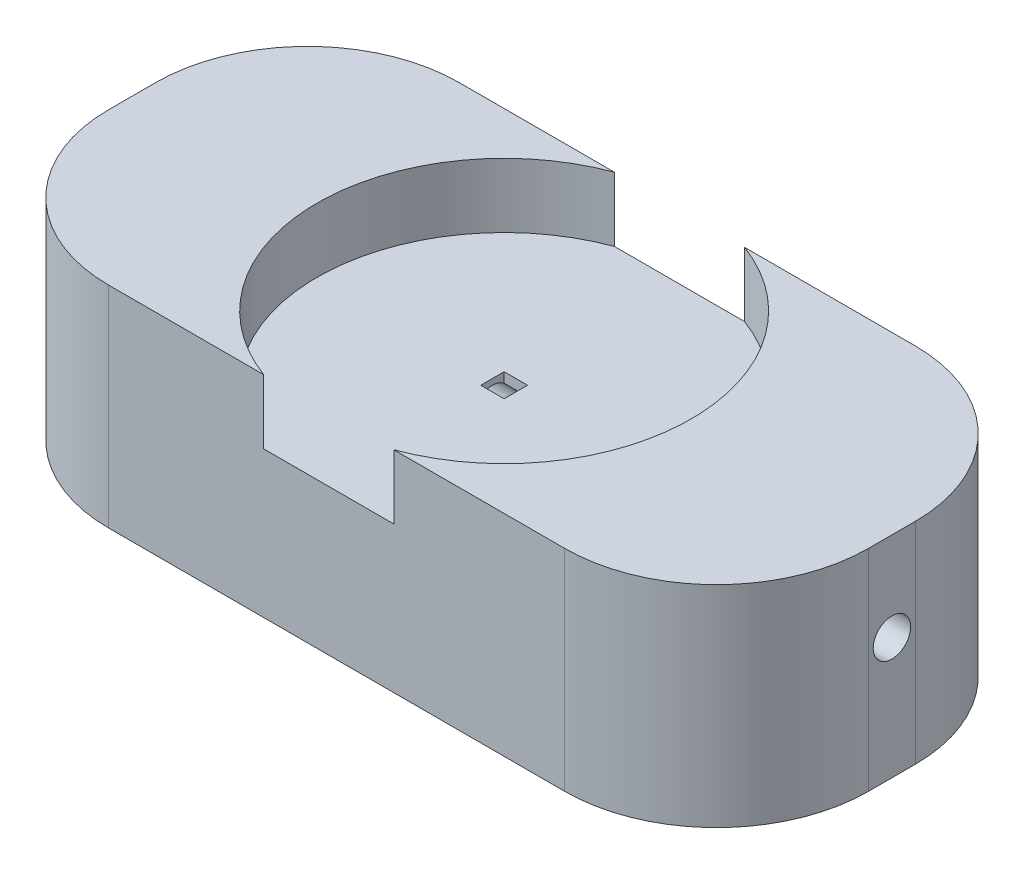
ISO-10303-21;
HEADER;
FILE_DESCRIPTION(('STEP AP214'),'2;1');
FILE_NAME('part.step','',(''),(''),'','','');
FILE_SCHEMA(('AUTOMOTIVE_DESIGN { 1 0 10303 214 1 1 1 1 }'));
ENDSEC;
DATA;
#1=APPLICATION_CONTEXT('core data for automotive mechanical design processes');
#2=APPLICATION_PROTOCOL_DEFINITION('international standard','automotive_design',2000,#1);
#3=PRODUCT_CONTEXT('',#1,'mechanical');
#4=PRODUCT('Part','Part','',(#3));
#5=PRODUCT_RELATED_PRODUCT_CATEGORY('part','',(#4));
#6=PRODUCT_DEFINITION_FORMATION('','',#4);
#7=PRODUCT_DEFINITION_CONTEXT('part definition',#1,'design');
#8=PRODUCT_DEFINITION('design','',#6,#7);
#9=PRODUCT_DEFINITION_SHAPE('','',#8);
#10=(LENGTH_UNIT() NAMED_UNIT(*) SI_UNIT(.MILLI.,.METRE.));
#11=(NAMED_UNIT(*) PLANE_ANGLE_UNIT() SI_UNIT($,.RADIAN.));
#12=(NAMED_UNIT(*) SI_UNIT($,.STERADIAN.) SOLID_ANGLE_UNIT());
#13=UNCERTAINTY_MEASURE_WITH_UNIT(LENGTH_MEASURE(1.E-05),#10,'distance_accuracy_value','');
#14=(GEOMETRIC_REPRESENTATION_CONTEXT(3) GLOBAL_UNCERTAINTY_ASSIGNED_CONTEXT((#13)) GLOBAL_UNIT_ASSIGNED_CONTEXT((#10,
#11,#12)) REPRESENTATION_CONTEXT('',''));
#15=CARTESIAN_POINT('',(0.,0.,0.));
#16=DIRECTION('',(0.,0.,1.));
#17=DIRECTION('',(1.,0.,0.));
#18=AXIS2_PLACEMENT_3D('',#15,#16,#17);
#19=CARTESIAN_POINT('',(0.,58.,0.));
#20=DIRECTION('',(0.,-1.,0.));
#21=DIRECTION('',(0.,0.,-1.));
#22=AXIS2_PLACEMENT_3D('',#19,#20,#21);
#23=PLANE('',#22);
#24=DIRECTION('',(-1.,0.,0.));
#25=VECTOR('',#24,1.);
#26=CARTESIAN_POINT('',(-25.,58.,-15.));
#27=LINE('',#26,#25);
#28=CARTESIAN_POINT('',(27.,58.,-15.));
#29=VERTEX_POINT('',#28);
#30=CARTESIAN_POINT('',(12.3962726493241,58.,-15.));
#31=VERTEX_POINT('',#30);
#32=EDGE_CURVE('E307',#29,#31,#27,.T.);
#33=ORIENTED_EDGE('',*,*,#32,.T.);
#34=CARTESIAN_POINT('',(6.82850828649366,58.,-1.6826817716975E-13));
#35=DIRECTION('',(0.,1.,0.));
#36=DIRECTION('',(0.,0.,1.));
#37=AXIS2_PLACEMENT_3D('',#34,#35,#36);
#38=CIRCLE('',#37,16.);
#39=CARTESIAN_POINT('',(12.3962726493232,58.,15.));
#40=VERTEX_POINT('',#39);
#41=EDGE_CURVE('E248',#40,#31,#38,.T.);
#42=ORIENTED_EDGE('',*,*,#41,.F.);
#43=DIRECTION('',(1.,0.,0.));
#44=VECTOR('',#43,1.);
#45=CARTESIAN_POINT('',(-25.,58.,15.));
#46=LINE('',#45,#44);
#47=CARTESIAN_POINT('',(27.,58.,15.));
#48=VERTEX_POINT('',#47);
#49=EDGE_CURVE('E315',#40,#48,#46,.T.);
#50=ORIENTED_EDGE('',*,*,#49,.T.);
#51=CARTESIAN_POINT('',(27.,58.,2.00000000000001));
#52=DIRECTION('',(0.,-1.,0.));
#53=DIRECTION('',(0.,0.,-1.));
#54=AXIS2_PLACEMENT_3D('',#51,#52,#53);
#55=CIRCLE('',#54,13.);
#56=CARTESIAN_POINT('',(40.,58.,2.00000000000001));
#57=VERTEX_POINT('',#56);
#58=EDGE_CURVE('E338',#48,#57,#55,.F.);
#59=ORIENTED_EDGE('',*,*,#58,.T.);
#60=DIRECTION('',(0.,0.,-1.));
#61=VECTOR('',#60,1.);
#62=CARTESIAN_POINT('',(40.,58.,15.));
#63=LINE('',#62,#61);
#64=CARTESIAN_POINT('',(40.,58.,-2.));
#65=VERTEX_POINT('',#64);
#66=EDGE_CURVE('E302',#57,#65,#63,.T.);
#67=ORIENTED_EDGE('',*,*,#66,.T.);
#68=CARTESIAN_POINT('',(27.,58.,-2.));
#69=DIRECTION('',(0.,-1.,0.));
#70=DIRECTION('',(0.,0.,-1.));
#71=AXIS2_PLACEMENT_3D('',#68,#69,#70);
#72=CIRCLE('',#71,13.);
#73=EDGE_CURVE('E344',#65,#29,#72,.F.);
#74=ORIENTED_EDGE('',*,*,#73,.T.);
#75=EDGE_LOOP('',(#33,#42,#50,#59,#67,#74));
#76=FACE_BOUND('',#75,.T.);
#77=ADVANCED_FACE('F47',(#76),#23,.F.);
#78=CARTESIAN_POINT('',(40.,58.,15.));
#79=DIRECTION('',(-1.,0.,0.));
#80=DIRECTION('',(0.,0.,1.));
#81=AXIS2_PLACEMENT_3D('',#78,#79,#80);
#82=PLANE('',#81);
#83=CARTESIAN_POINT('',(40.,50.4,0.));
#84=DIRECTION('',(-1.,0.,0.));
#85=DIRECTION('',(0.,0.,1.));
#86=AXIS2_PLACEMENT_3D('',#83,#84,#85);
#87=CIRCLE('',#86,1.6);
#88=CARTESIAN_POINT('',(40.,50.4,1.6));
#89=VERTEX_POINT('',#88);
#90=EDGE_CURVE('E244',#89,#89,#87,.T.);
#91=ORIENTED_EDGE('',*,*,#90,.T.);
#92=EDGE_LOOP('',(#91));
#93=FACE_BOUND('',#92,.T.);
#94=DIRECTION('',(0.,0.,1.));
#95=VECTOR('',#94,1.);
#96=CARTESIAN_POINT('',(40.,40.,15.));
#97=LINE('',#96,#95);
#98=CARTESIAN_POINT('',(40.,40.,-2.));
#99=VERTEX_POINT('',#98);
#100=CARTESIAN_POINT('',(40.,40.,2.00000000000001));
#101=VERTEX_POINT('',#100);
#102=EDGE_CURVE('E295',#99,#101,#97,.T.);
#103=ORIENTED_EDGE('',*,*,#102,.F.);
#104=DIRECTION('',(0.,-1.,0.));
#105=VECTOR('',#104,1.);
#106=CARTESIAN_POINT('',(40.,58.,-2.));
#107=LINE('',#106,#105);
#108=EDGE_CURVE('E332',#99,#65,#107,.F.);
#109=ORIENTED_EDGE('',*,*,#108,.T.);
#110=ORIENTED_EDGE('',*,*,#66,.F.);
#111=DIRECTION('',(0.,-1.,0.));
#112=VECTOR('',#111,1.);
#113=CARTESIAN_POINT('',(40.,58.,2.00000000000001));
#114=LINE('',#113,#112);
#115=EDGE_CURVE('E328',#57,#101,#114,.T.);
#116=ORIENTED_EDGE('',*,*,#115,.T.);
#117=EDGE_LOOP('',(#103,#109,#110,#116));
#118=FACE_BOUND('',#117,.T.);
#119=ADVANCED_FACE('F414',(#93,#118),#82,.F.);
#120=CARTESIAN_POINT('',(-25.,58.,-15.));
#121=DIRECTION('',(0.,0.,1.));
#122=DIRECTION('',(1.,0.,0.));
#123=AXIS2_PLACEMENT_3D('',#120,#121,#122);
#124=PLANE('',#123);
#125=DIRECTION('',(-1.,0.,0.));
#126=VECTOR('',#125,1.);
#127=CARTESIAN_POINT('',(-25.,52.5,-15.));
#128=LINE('',#127,#126);
#129=CARTESIAN_POINT('',(12.3962726493241,52.5,-15.));
#130=VERTEX_POINT('',#129);
#131=CARTESIAN_POINT('',(1.26074392366317,52.5,-15.));
#132=VERTEX_POINT('',#131);
#133=EDGE_CURVE('E275',#130,#132,#128,.T.);
#134=ORIENTED_EDGE('',*,*,#133,.F.);
#135=DIRECTION('',(0.,1.,0.));
#136=VECTOR('',#135,1.);
#137=CARTESIAN_POINT('',(12.3962726493241,52.5,-15.));
#138=LINE('',#137,#136);
#139=EDGE_CURVE('E271',#130,#31,#138,.T.);
#140=ORIENTED_EDGE('',*,*,#139,.T.);
#141=ORIENTED_EDGE('',*,*,#32,.F.);
#142=DIRECTION('',(0.,-1.,0.));
#143=VECTOR('',#142,1.);
#144=CARTESIAN_POINT('',(27.,58.,-15.));
#145=LINE('',#144,#143);
#146=CARTESIAN_POINT('',(27.,40.,-15.));
#147=VERTEX_POINT('',#146);
#148=EDGE_CURVE('E324',#29,#147,#145,.T.);
#149=ORIENTED_EDGE('',*,*,#148,.T.);
#150=DIRECTION('',(1.,0.,0.));
#151=VECTOR('',#150,1.);
#152=CARTESIAN_POINT('',(-25.,40.,-15.));
#153=LINE('',#152,#151);
#154=CARTESIAN_POINT('',(-12.,40.,-15.));
#155=VERTEX_POINT('',#154);
#156=EDGE_CURVE('E292',#155,#147,#153,.T.);
#157=ORIENTED_EDGE('',*,*,#156,.F.);
#158=DIRECTION('',(0.,-1.,0.));
#159=VECTOR('',#158,1.);
#160=CARTESIAN_POINT('',(-12.,58.,-15.));
#161=LINE('',#160,#159);
#162=CARTESIAN_POINT('',(-12.,58.,-15.));
#163=VERTEX_POINT('',#162);
#164=EDGE_CURVE('E320',#155,#163,#161,.F.);
#165=ORIENTED_EDGE('',*,*,#164,.T.);
#166=CARTESIAN_POINT('',(1.26074392366317,58.,-15.));
#167=VERTEX_POINT('',#166);
#168=EDGE_CURVE('E306',#167,#163,#27,.T.);
#169=ORIENTED_EDGE('',*,*,#168,.F.);
#170=DIRECTION('',(0.,1.,0.));
#171=VECTOR('',#170,1.);
#172=CARTESIAN_POINT('',(1.26074392366316,52.5,-15.));
#173=LINE('',#172,#171);
#174=EDGE_CURVE('E267',#167,#132,#173,.F.);
#175=ORIENTED_EDGE('',*,*,#174,.T.);
#176=EDGE_LOOP('',(#134,#140,#141,#149,#157,#165,#169,#175));
#177=FACE_BOUND('',#176,.T.);
#178=ADVANCED_FACE('F423',(#177),#124,.F.);
#179=CARTESIAN_POINT('',(-25.,58.,15.));
#180=DIRECTION('',(1.,0.,0.));
#181=DIRECTION('',(0.,0.,-1.));
#182=AXIS2_PLACEMENT_3D('',#179,#180,#181);
#183=PLANE('',#182);
#184=CARTESIAN_POINT('',(-25.,50.4,0.));
#185=DIRECTION('',(-1.,0.,0.));
#186=DIRECTION('',(0.,0.,1.));
#187=AXIS2_PLACEMENT_3D('',#184,#185,#186);
#188=CIRCLE('',#187,1.6);
#189=CARTESIAN_POINT('',(-25.,50.4,1.6));
#190=VERTEX_POINT('',#189);
#191=EDGE_CURVE('E235',#190,#190,#188,.T.);
#192=ORIENTED_EDGE('',*,*,#191,.F.);
#193=EDGE_LOOP('',(#192));
#194=FACE_BOUND('',#193,.T.);
#195=DIRECTION('',(0.,0.,-1.));
#196=VECTOR('',#195,1.);
#197=CARTESIAN_POINT('',(-25.,40.,15.));
#198=LINE('',#197,#196);
#199=CARTESIAN_POINT('',(-25.,40.,2.00000000000001));
#200=VERTEX_POINT('',#199);
#201=CARTESIAN_POINT('',(-25.,40.,-1.99999999999999));
#202=VERTEX_POINT('',#201);
#203=EDGE_CURVE('E281',#200,#202,#198,.T.);
#204=ORIENTED_EDGE('',*,*,#203,.F.);
#205=DIRECTION('',(0.,-1.,0.));
#206=VECTOR('',#205,1.);
#207=CARTESIAN_POINT('',(-25.,58.,2.00000000000001));
#208=LINE('',#207,#206);
#209=CARTESIAN_POINT('',(-25.,58.,2.00000000000001));
#210=VERTEX_POINT('',#209);
#211=EDGE_CURVE('E347',#200,#210,#208,.F.);
#212=ORIENTED_EDGE('',*,*,#211,.T.);
#213=DIRECTION('',(0.,0.,1.));
#214=VECTOR('',#213,1.);
#215=CARTESIAN_POINT('',(-25.,58.,15.));
#216=LINE('',#215,#214);
#217=CARTESIAN_POINT('',(-25.,58.,-1.99999999999999));
#218=VERTEX_POINT('',#217);
#219=EDGE_CURVE('E311',#218,#210,#216,.T.);
#220=ORIENTED_EDGE('',*,*,#219,.F.);
#221=DIRECTION('',(0.,-1.,0.));
#222=VECTOR('',#221,1.);
#223=CARTESIAN_POINT('',(-25.,58.,-1.99999999999999));
#224=LINE('',#223,#222);
#225=EDGE_CURVE('E350',#218,#202,#224,.T.);
#226=ORIENTED_EDGE('',*,*,#225,.T.);
#227=EDGE_LOOP('',(#204,#212,#220,#226));
#228=FACE_BOUND('',#227,.T.);
#229=ADVANCED_FACE('F451',(#194,#228),#183,.F.);
#230=CARTESIAN_POINT('',(-25.,58.,15.));
#231=DIRECTION('',(0.,0.,-1.));
#232=DIRECTION('',(-1.,0.,0.));
#233=AXIS2_PLACEMENT_3D('',#230,#231,#232);
#234=PLANE('',#233);
#235=DIRECTION('',(1.,0.,0.));
#236=VECTOR('',#235,1.);
#237=CARTESIAN_POINT('',(-25.,52.5,15.));
#238=LINE('',#237,#236);
#239=CARTESIAN_POINT('',(1.2607439236641,52.5,15.));
#240=VERTEX_POINT('',#239);
#241=CARTESIAN_POINT('',(12.3962726493232,52.5,15.));
#242=VERTEX_POINT('',#241);
#243=EDGE_CURVE('E370',#240,#242,#238,.T.);
#244=ORIENTED_EDGE('',*,*,#243,.F.);
#245=DIRECTION('',(0.,1.,0.));
#246=VECTOR('',#245,1.);
#247=CARTESIAN_POINT('',(1.26074392366409,52.5,15.));
#248=LINE('',#247,#246);
#249=CARTESIAN_POINT('',(1.2607439236641,58.,15.));
#250=VERTEX_POINT('',#249);
#251=EDGE_CURVE('E263',#240,#250,#248,.T.);
#252=ORIENTED_EDGE('',*,*,#251,.T.);
#253=CARTESIAN_POINT('',(-12.,58.,15.));
#254=VERTEX_POINT('',#253);
#255=EDGE_CURVE('E316',#254,#250,#46,.T.);
#256=ORIENTED_EDGE('',*,*,#255,.F.);
#257=DIRECTION('',(0.,-1.,0.));
#258=VECTOR('',#257,1.);
#259=CARTESIAN_POINT('',(-12.,58.,15.));
#260=LINE('',#259,#258);
#261=CARTESIAN_POINT('',(-12.,40.,15.));
#262=VERTEX_POINT('',#261);
#263=EDGE_CURVE('E354',#254,#262,#260,.T.);
#264=ORIENTED_EDGE('',*,*,#263,.T.);
#265=DIRECTION('',(-1.,0.,0.));
#266=VECTOR('',#265,1.);
#267=CARTESIAN_POINT('',(-25.,40.,15.));
#268=LINE('',#267,#266);
#269=CARTESIAN_POINT('',(27.,40.,15.));
#270=VERTEX_POINT('',#269);
#271=EDGE_CURVE('E278',#270,#262,#268,.T.);
#272=ORIENTED_EDGE('',*,*,#271,.F.);
#273=DIRECTION('',(0.,-1.,0.));
#274=VECTOR('',#273,1.);
#275=CARTESIAN_POINT('',(27.,58.,15.));
#276=LINE('',#275,#274);
#277=EDGE_CURVE('E358',#270,#48,#276,.F.);
#278=ORIENTED_EDGE('',*,*,#277,.T.);
#279=ORIENTED_EDGE('',*,*,#49,.F.);
#280=DIRECTION('',(0.,1.,0.));
#281=VECTOR('',#280,1.);
#282=CARTESIAN_POINT('',(12.3962726493232,52.5,15.));
#283=LINE('',#282,#281);
#284=EDGE_CURVE('E256',#40,#242,#283,.F.);
#285=ORIENTED_EDGE('',*,*,#284,.T.);
#286=EDGE_LOOP('',(#244,#252,#256,#264,#272,#278,#279,#285));
#287=FACE_BOUND('',#286,.T.);
#288=ADVANCED_FACE('F446',(#287),#234,.F.);
#289=CARTESIAN_POINT('',(27.,58.,-2.));
#290=DIRECTION('',(0.,-1.,0.));
#291=DIRECTION('',(0.,0.,-1.));
#292=AXIS2_PLACEMENT_3D('',#289,#290,#291);
#293=CYLINDRICAL_SURFACE('',#292,13.);
#294=ORIENTED_EDGE('',*,*,#108,.F.);
#295=CARTESIAN_POINT('',(27.,40.,-2.));
#296=DIRECTION('',(0.,-1.,0.));
#297=DIRECTION('',(0.,0.,-1.));
#298=AXIS2_PLACEMENT_3D('',#295,#296,#297);
#299=CIRCLE('',#298,13.);
#300=EDGE_CURVE('E298',#99,#147,#299,.F.);
#301=ORIENTED_EDGE('',*,*,#300,.T.);
#302=ORIENTED_EDGE('',*,*,#148,.F.);
#303=ORIENTED_EDGE('',*,*,#73,.F.);
#304=EDGE_LOOP('',(#294,#301,#302,#303));
#305=FACE_BOUND('',#304,.T.);
#306=ADVANCED_FACE('F466',(#305),#293,.T.);
#307=CARTESIAN_POINT('',(-12.,58.,-1.99999999999999));
#308=DIRECTION('',(0.,-1.,0.));
#309=DIRECTION('',(0.,0.,-1.));
#310=AXIS2_PLACEMENT_3D('',#307,#308,#309);
#311=CYLINDRICAL_SURFACE('',#310,13.);
#312=ORIENTED_EDGE('',*,*,#164,.F.);
#313=CARTESIAN_POINT('',(-12.,40.,-1.99999999999999));
#314=DIRECTION('',(0.,-1.,0.));
#315=DIRECTION('',(0.,0.,-1.));
#316=AXIS2_PLACEMENT_3D('',#313,#314,#315);
#317=CIRCLE('',#316,13.);
#318=EDGE_CURVE('E288',#155,#202,#317,.F.);
#319=ORIENTED_EDGE('',*,*,#318,.T.);
#320=ORIENTED_EDGE('',*,*,#225,.F.);
#321=CARTESIAN_POINT('',(-12.,58.,-1.99999999999999));
#322=DIRECTION('',(0.,-1.,0.));
#323=DIRECTION('',(0.,0.,-1.));
#324=AXIS2_PLACEMENT_3D('',#321,#322,#323);
#325=CIRCLE('',#324,13.);
#326=EDGE_CURVE('E341',#163,#218,#325,.F.);
#327=ORIENTED_EDGE('',*,*,#326,.F.);
#328=EDGE_LOOP('',(#312,#319,#320,#327));
#329=FACE_BOUND('',#328,.T.);
#330=ADVANCED_FACE('F457',(#329),#311,.T.);
#331=CARTESIAN_POINT('',(27.,58.,2.00000000000001));
#332=DIRECTION('',(0.,-1.,0.));
#333=DIRECTION('',(0.,0.,-1.));
#334=AXIS2_PLACEMENT_3D('',#331,#332,#333);
#335=CYLINDRICAL_SURFACE('',#334,13.);
#336=ORIENTED_EDGE('',*,*,#277,.F.);
#337=CARTESIAN_POINT('',(27.,40.,2.00000000000001));
#338=DIRECTION('',(0.,-1.,0.));
#339=DIRECTION('',(0.,0.,-1.));
#340=AXIS2_PLACEMENT_3D('',#337,#338,#339);
#341=CIRCLE('',#340,13.);
#342=EDGE_CURVE('E284',#270,#101,#341,.F.);
#343=ORIENTED_EDGE('',*,*,#342,.T.);
#344=ORIENTED_EDGE('',*,*,#115,.F.);
#345=ORIENTED_EDGE('',*,*,#58,.F.);
#346=EDGE_LOOP('',(#336,#343,#344,#345));
#347=FACE_BOUND('',#346,.T.);
#348=ADVANCED_FACE('F438',(#347),#335,.T.);
#349=CARTESIAN_POINT('',(-12.,58.,2.00000000000001));
#350=DIRECTION('',(0.,-1.,0.));
#351=DIRECTION('',(0.,0.,-1.));
#352=AXIS2_PLACEMENT_3D('',#349,#350,#351);
#353=CYLINDRICAL_SURFACE('',#352,13.);
#354=ORIENTED_EDGE('',*,*,#211,.F.);
#355=CARTESIAN_POINT('',(-12.,40.,2.00000000000001));
#356=DIRECTION('',(0.,-1.,0.));
#357=DIRECTION('',(0.,0.,-1.));
#358=AXIS2_PLACEMENT_3D('',#355,#356,#357);
#359=CIRCLE('',#358,13.);
#360=EDGE_CURVE('E362',#200,#262,#359,.F.);
#361=ORIENTED_EDGE('',*,*,#360,.T.);
#362=ORIENTED_EDGE('',*,*,#263,.F.);
#363=CARTESIAN_POINT('',(-12.,58.,2.00000000000001));
#364=DIRECTION('',(0.,-1.,0.));
#365=DIRECTION('',(0.,0.,-1.));
#366=AXIS2_PLACEMENT_3D('',#363,#364,#365);
#367=CIRCLE('',#366,13.);
#368=EDGE_CURVE('E335',#210,#254,#367,.F.);
#369=ORIENTED_EDGE('',*,*,#368,.F.);
#370=EDGE_LOOP('',(#354,#361,#362,#369));
#371=FACE_BOUND('',#370,.T.);
#372=ADVANCED_FACE('F49',(#371),#353,.T.);
#373=ORIENTED_EDGE('',*,*,#255,.T.);
#374=CARTESIAN_POINT('',(6.82850828649366,58.,-1.6826817716975E-13));
#375=DIRECTION('',(0.,-1.,0.));
#376=DIRECTION('',(0.,0.,-1.));
#377=AXIS2_PLACEMENT_3D('',#374,#375,#376);
#378=CIRCLE('',#377,16.);
#379=EDGE_CURVE('E366',#250,#167,#378,.T.);
#380=ORIENTED_EDGE('',*,*,#379,.T.);
#381=ORIENTED_EDGE('',*,*,#168,.T.);
#382=ORIENTED_EDGE('',*,*,#326,.T.);
#383=ORIENTED_EDGE('',*,*,#219,.T.);
#384=ORIENTED_EDGE('',*,*,#368,.T.);
#385=EDGE_LOOP('',(#373,#380,#381,#382,#383,#384));
#386=FACE_BOUND('',#385,.T.);
#387=ADVANCED_FACE('F417',(#386),#23,.F.);
#388=CARTESIAN_POINT('',(0.,40.,0.));
#389=DIRECTION('',(0.,-1.,0.));
#390=DIRECTION('',(0.,0.,-1.));
#391=AXIS2_PLACEMENT_3D('',#388,#389,#390);
#392=PLANE('',#391);
#393=ORIENTED_EDGE('',*,*,#102,.T.);
#394=ORIENTED_EDGE('',*,*,#342,.F.);
#395=ORIENTED_EDGE('',*,*,#271,.T.);
#396=ORIENTED_EDGE('',*,*,#360,.F.);
#397=ORIENTED_EDGE('',*,*,#203,.T.);
#398=ORIENTED_EDGE('',*,*,#318,.F.);
#399=ORIENTED_EDGE('',*,*,#156,.T.);
#400=ORIENTED_EDGE('',*,*,#300,.F.);
#401=EDGE_LOOP('',(#393,#394,#395,#396,#397,#398,#399,#400));
#402=FACE_BOUND('',#401,.T.);
#403=ADVANCED_FACE('F429',(#402),#392,.T.);
#404=CARTESIAN_POINT('',(6.82850828649366,52.5,-1.6826817716975E-13));
#405=DIRECTION('',(0.,1.,0.));
#406=DIRECTION('',(0.,0.,1.));
#407=AXIS2_PLACEMENT_3D('',#404,#405,#406);
#408=PLANE('',#407);
#409=DIRECTION('',(0.,0.,-1.));
#410=VECTOR('',#409,1.);
#411=CARTESIAN_POINT('',(7.82850828649366,52.5,0.999999999999832));
#412=LINE('',#411,#410);
#413=CARTESIAN_POINT('',(7.82850828649366,52.5,0.999999999999832));
#414=VERTEX_POINT('',#413);
#415=CARTESIAN_POINT('',(7.82850828649366,52.5,-1.00000000000017));
#416=VERTEX_POINT('',#415);
#417=EDGE_CURVE('E65',#414,#416,#412,.T.);
#418=ORIENTED_EDGE('',*,*,#417,.F.);
#419=DIRECTION('',(1.,0.,0.));
#420=VECTOR('',#419,1.);
#421=CARTESIAN_POINT('',(5.82850828649366,52.5,0.999999999999832));
#422=LINE('',#421,#420);
#423=CARTESIAN_POINT('',(5.82850828649366,52.5,0.999999999999832));
#424=VERTEX_POINT('',#423);
#425=EDGE_CURVE('E212',#424,#414,#422,.T.);
#426=ORIENTED_EDGE('',*,*,#425,.F.);
#427=DIRECTION('',(0.,0.,1.));
#428=VECTOR('',#427,1.);
#429=CARTESIAN_POINT('',(5.82850828649366,52.5,0.999999999999832));
#430=LINE('',#429,#428);
#431=CARTESIAN_POINT('',(5.82850828649366,52.5,-1.00000000000017));
#432=VERTEX_POINT('',#431);
#433=EDGE_CURVE('E216',#432,#424,#430,.T.);
#434=ORIENTED_EDGE('',*,*,#433,.F.);
#435=DIRECTION('',(-1.,0.,0.));
#436=VECTOR('',#435,1.);
#437=CARTESIAN_POINT('',(5.82850828649366,52.5,-1.00000000000017));
#438=LINE('',#437,#436);
#439=EDGE_CURVE('E225',#416,#432,#438,.T.);
#440=ORIENTED_EDGE('',*,*,#439,.F.);
#441=EDGE_LOOP('',(#418,#426,#434,#440));
#442=FACE_BOUND('',#441,.T.);
#443=ORIENTED_EDGE('',*,*,#133,.T.);
#444=CARTESIAN_POINT('',(6.82850828649366,52.5,-1.6826817716975E-13));
#445=DIRECTION('',(0.,1.,0.));
#446=DIRECTION('',(0.,0.,1.));
#447=AXIS2_PLACEMENT_3D('',#444,#445,#446);
#448=CIRCLE('',#447,16.);
#449=EDGE_CURVE('E257',#132,#240,#448,.T.);
#450=ORIENTED_EDGE('',*,*,#449,.T.);
#451=ORIENTED_EDGE('',*,*,#243,.T.);
#452=EDGE_CURVE('E252',#242,#130,#448,.T.);
#453=ORIENTED_EDGE('',*,*,#452,.T.);
#454=EDGE_LOOP('',(#443,#450,#451,#453));
#455=FACE_BOUND('',#454,.T.);
#456=ADVANCED_FACE('F435',(#442,#455),#408,.T.);
#457=CARTESIAN_POINT('',(6.82850828649366,52.5,-1.6826817716975E-13));
#458=DIRECTION('',(0.,1.,0.));
#459=DIRECTION('',(0.,0.,1.));
#460=AXIS2_PLACEMENT_3D('',#457,#458,#459);
#461=CYLINDRICAL_SURFACE('',#460,16.);
#462=ORIENTED_EDGE('',*,*,#452,.F.);
#463=ORIENTED_EDGE('',*,*,#284,.F.);
#464=ORIENTED_EDGE('',*,*,#41,.T.);
#465=ORIENTED_EDGE('',*,*,#139,.F.);
#466=EDGE_LOOP('',(#462,#463,#464,#465));
#467=FACE_BOUND('',#466,.T.);
#468=ADVANCED_FACE('F570',(#467),#461,.F.);
#469=ORIENTED_EDGE('',*,*,#379,.F.);
#470=ORIENTED_EDGE('',*,*,#251,.F.);
#471=ORIENTED_EDGE('',*,*,#449,.F.);
#472=ORIENTED_EDGE('',*,*,#174,.F.);
#473=EDGE_LOOP('',(#469,#470,#471,#472));
#474=FACE_BOUND('',#473,.T.);
#475=ADVANCED_FACE('F560',(#474),#461,.F.);
#476=CARTESIAN_POINT('',(40.,50.4,0.));
#477=DIRECTION('',(-1.,0.,0.));
#478=DIRECTION('',(0.,0.,1.));
#479=AXIS2_PLACEMENT_3D('',#476,#477,#478);
#480=CYLINDRICAL_SURFACE('',#479,1.6);
#481=DIRECTION('',(-1.,0.,0.));
#482=VECTOR('',#481,1.);
#483=CARTESIAN_POINT('',(40.,49.1510004003205,-1.00000000000017));
#484=LINE('',#483,#482);
#485=CARTESIAN_POINT('',(5.82850828649366,49.1510004003205,-1.00000000000017));
#486=VERTEX_POINT('',#485);
#487=CARTESIAN_POINT('',(7.82850828649365,49.1510004003205,-1.00000000000017));
#488=VERTEX_POINT('',#487);
#489=EDGE_CURVE('E387',#486,#488,#484,.F.);
#490=ORIENTED_EDGE('',*,*,#489,.T.);
#491=CARTESIAN_POINT('',(7.82850828649365,50.4,0.));
#492=DIRECTION('',(1.,0.,0.));
#493=DIRECTION('',(0.,0.,-1.));
#494=AXIS2_PLACEMENT_3D('',#491,#492,#493);
#495=CIRCLE('',#494,1.6);
#496=CARTESIAN_POINT('',(7.82850828649366,49.1510004003202,0.999999999999832));
#497=VERTEX_POINT('',#496);
#498=EDGE_CURVE('E11',#488,#497,#495,.F.);
#499=ORIENTED_EDGE('',*,*,#498,.T.);
#500=DIRECTION('',(-1.,0.,0.));
#501=VECTOR('',#500,1.);
#502=CARTESIAN_POINT('',(40.,49.1510004003202,0.999999999999832));
#503=LINE('',#502,#501);
#504=CARTESIAN_POINT('',(5.82850828649366,49.1510004003202,0.999999999999832));
#505=VERTEX_POINT('',#504);
#506=EDGE_CURVE('E51',#497,#505,#503,.T.);
#507=ORIENTED_EDGE('',*,*,#506,.T.);
#508=CARTESIAN_POINT('',(5.82850828649366,50.4,0.));
#509=DIRECTION('',(-1.,0.,0.));
#510=DIRECTION('',(0.,0.,1.));
#511=AXIS2_PLACEMENT_3D('',#508,#509,#510);
#512=CIRCLE('',#511,1.6);
#513=EDGE_CURVE('E382',#505,#486,#512,.F.);
#514=ORIENTED_EDGE('',*,*,#513,.T.);
#515=EDGE_LOOP('',(#490,#499,#507,#514));
#516=FACE_BOUND('',#515,.T.);
#517=DIRECTION('',(-1.,0.,0.));
#518=VECTOR('',#517,1.);
#519=CARTESIAN_POINT('',(40.,51.6489995996798,0.999999999999832));
#520=LINE('',#519,#518);
#521=CARTESIAN_POINT('',(5.82850828649366,51.6489995996798,0.999999999999832));
#522=VERTEX_POINT('',#521);
#523=CARTESIAN_POINT('',(7.82850828649366,51.6489995996798,0.999999999999832));
#524=VERTEX_POINT('',#523);
#525=EDGE_CURVE('E381',#522,#524,#520,.F.);
#526=ORIENTED_EDGE('',*,*,#525,.T.);
#527=CARTESIAN_POINT('',(7.82850828649366,51.6489995996795,-1.00000000000017));
#528=VERTEX_POINT('',#527);
#529=EDGE_CURVE('E58',#524,#528,#495,.F.);
#530=ORIENTED_EDGE('',*,*,#529,.T.);
#531=DIRECTION('',(-1.,0.,0.));
#532=VECTOR('',#531,1.);
#533=CARTESIAN_POINT('',(40.,51.6489995996795,-1.00000000000017));
#534=LINE('',#533,#532);
#535=CARTESIAN_POINT('',(5.82850828649366,51.6489995996795,-1.00000000000017));
#536=VERTEX_POINT('',#535);
#537=EDGE_CURVE('E373',#528,#536,#534,.T.);
#538=ORIENTED_EDGE('',*,*,#537,.T.);
#539=EDGE_CURVE('E377',#536,#522,#512,.F.);
#540=ORIENTED_EDGE('',*,*,#539,.T.);
#541=EDGE_LOOP('',(#526,#530,#538,#540));
#542=FACE_BOUND('',#541,.T.);
#543=ORIENTED_EDGE('',*,*,#90,.F.);
#544=EDGE_LOOP('',(#543));
#545=FACE_BOUND('',#544,.T.);
#546=ORIENTED_EDGE('',*,*,#191,.T.);
#547=EDGE_LOOP('',(#546));
#548=FACE_BOUND('',#547,.T.);
#549=ADVANCED_FACE('F394',(#516,#542,#545,#548),#480,.F.);
#550=CARTESIAN_POINT('',(5.82850828649366,44.5,-1.00000000000017));
#551=DIRECTION('',(0.,0.,-1.));
#552=DIRECTION('',(-1.,0.,0.));
#553=AXIS2_PLACEMENT_3D('',#550,#551,#552);
#554=PLANE('',#553);
#555=DIRECTION('',(0.,1.,0.));
#556=VECTOR('',#555,1.);
#557=CARTESIAN_POINT('',(7.82850828649366,44.5,-1.00000000000017));
#558=LINE('',#557,#556);
#559=EDGE_CURVE('E195',#528,#416,#558,.T.);
#560=ORIENTED_EDGE('',*,*,#559,.T.);
#561=ORIENTED_EDGE('',*,*,#439,.T.);
#562=DIRECTION('',(0.,1.,0.));
#563=VECTOR('',#562,1.);
#564=CARTESIAN_POINT('',(5.82850828649366,44.5,-1.00000000000017));
#565=LINE('',#564,#563);
#566=EDGE_CURVE('E194',#536,#432,#565,.T.);
#567=ORIENTED_EDGE('',*,*,#566,.F.);
#568=ORIENTED_EDGE('',*,*,#537,.F.);
#569=EDGE_LOOP('',(#560,#561,#567,#568));
#570=FACE_BOUND('',#569,.T.);
#571=ADVANCED_FACE('F408',(#570),#554,.F.);
#572=CARTESIAN_POINT('',(5.82850828649366,44.5,0.999999999999832));
#573=DIRECTION('',(-1.,0.,0.));
#574=DIRECTION('',(0.,0.,1.));
#575=AXIS2_PLACEMENT_3D('',#572,#573,#574);
#576=PLANE('',#575);
#577=ORIENTED_EDGE('',*,*,#566,.T.);
#578=ORIENTED_EDGE('',*,*,#433,.T.);
#579=DIRECTION('',(0.,1.,0.));
#580=VECTOR('',#579,1.);
#581=CARTESIAN_POINT('',(5.82850828649366,44.5,0.999999999999832));
#582=LINE('',#581,#580);
#583=EDGE_CURVE('E241',#522,#424,#582,.T.);
#584=ORIENTED_EDGE('',*,*,#583,.F.);
#585=ORIENTED_EDGE('',*,*,#539,.F.);
#586=EDGE_LOOP('',(#577,#578,#584,#585));
#587=FACE_BOUND('',#586,.T.);
#588=ADVANCED_FACE('F402',(#587),#576,.F.);
#589=CARTESIAN_POINT('',(5.82850828649366,44.5,0.999999999999832));
#590=DIRECTION('',(0.,0.,1.));
#591=DIRECTION('',(1.,0.,0.));
#592=AXIS2_PLACEMENT_3D('',#589,#590,#591);
#593=PLANE('',#592);
#594=ORIENTED_EDGE('',*,*,#583,.T.);
#595=ORIENTED_EDGE('',*,*,#425,.T.);
#596=DIRECTION('',(0.,1.,0.));
#597=VECTOR('',#596,1.);
#598=CARTESIAN_POINT('',(7.82850828649366,44.5,0.999999999999832));
#599=LINE('',#598,#597);
#600=EDGE_CURVE('E236',#524,#414,#599,.T.);
#601=ORIENTED_EDGE('',*,*,#600,.F.);
#602=ORIENTED_EDGE('',*,*,#525,.F.);
#603=EDGE_LOOP('',(#594,#595,#601,#602));
#604=FACE_BOUND('',#603,.T.);
#605=ADVANCED_FACE('F410',(#604),#593,.F.);
#606=CARTESIAN_POINT('',(7.82850828649366,44.5,0.999999999999832));
#607=DIRECTION('',(1.,0.,0.));
#608=DIRECTION('',(0.,0.,-1.));
#609=AXIS2_PLACEMENT_3D('',#606,#607,#608);
#610=PLANE('',#609);
#611=ORIENTED_EDGE('',*,*,#600,.T.);
#612=ORIENTED_EDGE('',*,*,#417,.T.);
#613=ORIENTED_EDGE('',*,*,#559,.F.);
#614=ORIENTED_EDGE('',*,*,#529,.F.);
#615=EDGE_LOOP('',(#611,#612,#613,#614));
#616=FACE_BOUND('',#615,.T.);
#617=ADVANCED_FACE('F494',(#616),#610,.F.);
#618=CARTESIAN_POINT('',(7.82850828649366,44.5,-1.00000000000017));
#619=VERTEX_POINT('',#618);
#620=EDGE_CURVE('E73',#619,#488,#558,.T.);
#621=ORIENTED_EDGE('',*,*,#620,.F.);
#622=DIRECTION('',(0.,0.,-1.));
#623=VECTOR('',#622,1.);
#624=CARTESIAN_POINT('',(7.82850828649366,44.5,0.999999999999832));
#625=LINE('',#624,#623);
#626=CARTESIAN_POINT('',(7.82850828649366,44.5,0.999999999999832));
#627=VERTEX_POINT('',#626);
#628=EDGE_CURVE('E190',#627,#619,#625,.T.);
#629=ORIENTED_EDGE('',*,*,#628,.F.);
#630=EDGE_CURVE('E232',#627,#497,#599,.T.);
#631=ORIENTED_EDGE('',*,*,#630,.T.);
#632=ORIENTED_EDGE('',*,*,#498,.F.);
#633=EDGE_LOOP('',(#621,#629,#631,#632));
#634=FACE_BOUND('',#633,.T.);
#635=ADVANCED_FACE('F187',(#634),#610,.F.);
#636=ORIENTED_EDGE('',*,*,#630,.F.);
#637=DIRECTION('',(1.,0.,0.));
#638=VECTOR('',#637,1.);
#639=CARTESIAN_POINT('',(5.82850828649366,44.5,0.999999999999832));
#640=LINE('',#639,#638);
#641=CARTESIAN_POINT('',(5.82850828649366,44.5,0.999999999999832));
#642=VERTEX_POINT('',#641);
#643=EDGE_CURVE('E210',#642,#627,#640,.T.);
#644=ORIENTED_EDGE('',*,*,#643,.F.);
#645=EDGE_CURVE('E237',#642,#505,#582,.T.);
#646=ORIENTED_EDGE('',*,*,#645,.T.);
#647=ORIENTED_EDGE('',*,*,#506,.F.);
#648=EDGE_LOOP('',(#636,#644,#646,#647));
#649=FACE_BOUND('',#648,.T.);
#650=ADVANCED_FACE('F397',(#649),#593,.F.);
#651=ORIENTED_EDGE('',*,*,#645,.F.);
#652=DIRECTION('',(0.,0.,1.));
#653=VECTOR('',#652,1.);
#654=CARTESIAN_POINT('',(5.82850828649366,44.5,0.999999999999832));
#655=LINE('',#654,#653);
#656=CARTESIAN_POINT('',(5.82850828649366,44.5,-1.00000000000017));
#657=VERTEX_POINT('',#656);
#658=EDGE_CURVE('E206',#657,#642,#655,.T.);
#659=ORIENTED_EDGE('',*,*,#658,.F.);
#660=EDGE_CURVE('E201',#657,#486,#565,.T.);
#661=ORIENTED_EDGE('',*,*,#660,.T.);
#662=ORIENTED_EDGE('',*,*,#513,.F.);
#663=EDGE_LOOP('',(#651,#659,#661,#662));
#664=FACE_BOUND('',#663,.T.);
#665=ADVANCED_FACE('F399',(#664),#576,.F.);
#666=ORIENTED_EDGE('',*,*,#660,.F.);
#667=DIRECTION('',(-1.,0.,0.));
#668=VECTOR('',#667,1.);
#669=CARTESIAN_POINT('',(5.82850828649366,44.5,-1.00000000000017));
#670=LINE('',#669,#668);
#671=EDGE_CURVE('E198',#619,#657,#670,.T.);
#672=ORIENTED_EDGE('',*,*,#671,.F.);
#673=ORIENTED_EDGE('',*,*,#620,.T.);
#674=ORIENTED_EDGE('',*,*,#489,.F.);
#675=EDGE_LOOP('',(#666,#672,#673,#674));
#676=FACE_BOUND('',#675,.T.);
#677=ADVANCED_FACE('F199',(#676),#554,.F.);
#678=CARTESIAN_POINT('',(0.,44.5,0.));
#679=DIRECTION('',(0.,-1.,0.));
#680=DIRECTION('',(0.,0.,-1.));
#681=AXIS2_PLACEMENT_3D('',#678,#679,#680);
#682=PLANE('',#681);
#683=ORIENTED_EDGE('',*,*,#628,.T.);
#684=ORIENTED_EDGE('',*,*,#671,.T.);
#685=ORIENTED_EDGE('',*,*,#658,.T.);
#686=ORIENTED_EDGE('',*,*,#643,.T.);
#687=EDGE_LOOP('',(#683,#684,#685,#686));
#688=FACE_BOUND('',#687,.T.);
#689=ADVANCED_FACE('F208',(#688),#682,.F.);
#690=CLOSED_SHELL('',(#77,#119,#178,#229,#288,#306,#330,#348,#372,#387,#403,#456,#468,#475,#549,
#571,#588,#605,#617,#635,#650,#665,#677,#689));
#691=MANIFOLD_SOLID_BREP('B2',#690);
#692=ADVANCED_BREP_SHAPE_REPRESENTATION('',(#18,#691),#14);
#693=SHAPE_DEFINITION_REPRESENTATION(#9,#692);
ENDSEC;
END-ISO-10303-21;
